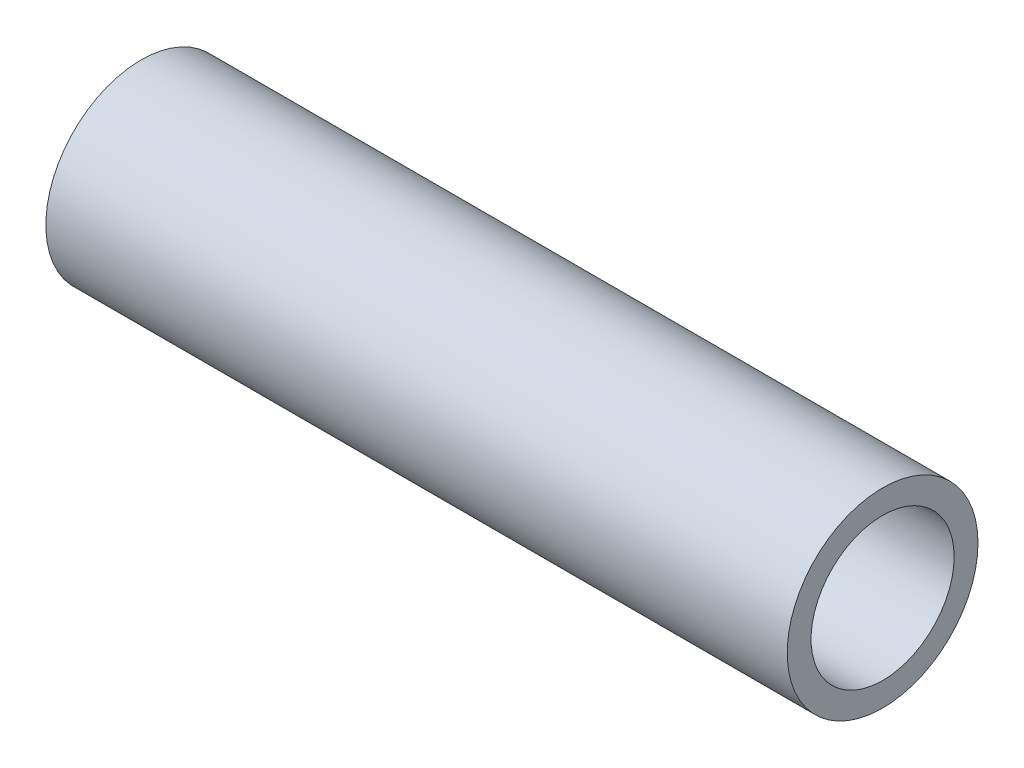
ISO-10303-21;
HEADER;
FILE_DESCRIPTION(('STEP AP214'),'2;1');
FILE_NAME('part.step','',(''),(''),'','','');
FILE_SCHEMA(('AUTOMOTIVE_DESIGN { 1 0 10303 214 1 1 1 1 }'));
ENDSEC;
DATA;
#1=APPLICATION_CONTEXT('core data for automotive mechanical design processes');
#2=APPLICATION_PROTOCOL_DEFINITION('international standard','automotive_design',2000,#1);
#3=PRODUCT_CONTEXT('',#1,'mechanical');
#4=PRODUCT('Part','Part','',(#3));
#5=PRODUCT_RELATED_PRODUCT_CATEGORY('part','',(#4));
#6=PRODUCT_DEFINITION_FORMATION('','',#4);
#7=PRODUCT_DEFINITION_CONTEXT('part definition',#1,'design');
#8=PRODUCT_DEFINITION('design','',#6,#7);
#9=PRODUCT_DEFINITION_SHAPE('','',#8);
#10=(LENGTH_UNIT() NAMED_UNIT(*) SI_UNIT(.MILLI.,.METRE.));
#11=(NAMED_UNIT(*) PLANE_ANGLE_UNIT() SI_UNIT($,.RADIAN.));
#12=(NAMED_UNIT(*) SI_UNIT($,.STERADIAN.) SOLID_ANGLE_UNIT());
#13=UNCERTAINTY_MEASURE_WITH_UNIT(LENGTH_MEASURE(1.E-05),#10,'distance_accuracy_value','');
#14=(GEOMETRIC_REPRESENTATION_CONTEXT(3) GLOBAL_UNCERTAINTY_ASSIGNED_CONTEXT((#13)) GLOBAL_UNIT_ASSIGNED_CONTEXT((#10,
#11,#12)) REPRESENTATION_CONTEXT('',''));
#15=CARTESIAN_POINT('',(0.,0.,0.));
#16=DIRECTION('',(0.,0.,1.));
#17=DIRECTION('',(1.,0.,0.));
#18=AXIS2_PLACEMENT_3D('',#15,#16,#17);
#19=CARTESIAN_POINT('',(54.4,0.,0.));
#20=DIRECTION('',(1.,0.,0.));
#21=DIRECTION('',(0.,0.,-1.));
#22=AXIS2_PLACEMENT_3D('',#19,#20,#21);
#23=PLANE('',#22);
#24=CARTESIAN_POINT('',(54.4,0.,0.));
#25=DIRECTION('',(1.,0.,0.));
#26=DIRECTION('',(0.,0.,-1.));
#27=AXIS2_PLACEMENT_3D('',#24,#25,#26);
#28=CIRCLE('',#27,7.);
#29=CARTESIAN_POINT('',(54.4,0.,-7.));
#30=VERTEX_POINT('',#29);
#31=EDGE_CURVE('E10',#30,#30,#28,.T.);
#32=ORIENTED_EDGE('',*,*,#31,.T.);
#33=EDGE_LOOP('',(#32));
#34=FACE_BOUND('',#33,.T.);
#35=CARTESIAN_POINT('',(54.4,0.,0.));
#36=DIRECTION('',(1.,0.,0.));
#37=DIRECTION('',(0.,0.,-1.));
#38=AXIS2_PLACEMENT_3D('',#35,#36,#37);
#39=CIRCLE('',#38,5.25);
#40=CARTESIAN_POINT('',(54.4,0.,-5.25));
#41=VERTEX_POINT('',#40);
#42=EDGE_CURVE('E54',#41,#41,#39,.T.);
#43=ORIENTED_EDGE('',*,*,#42,.F.);
#44=EDGE_LOOP('',(#43));
#45=FACE_BOUND('',#44,.T.);
#46=ADVANCED_FACE('F41',(#34,#45),#23,.T.);
#47=CARTESIAN_POINT('',(0.,0.,0.));
#48=DIRECTION('',(1.,0.,0.));
#49=DIRECTION('',(0.,0.,-1.));
#50=AXIS2_PLACEMENT_3D('',#47,#48,#49);
#51=PLANE('',#50);
#52=CARTESIAN_POINT('',(0.,0.,0.));
#53=DIRECTION('',(1.,0.,0.));
#54=DIRECTION('',(0.,0.,-1.));
#55=AXIS2_PLACEMENT_3D('',#52,#53,#54);
#56=CIRCLE('',#55,7.);
#57=CARTESIAN_POINT('',(0.,0.,-7.));
#58=VERTEX_POINT('',#57);
#59=EDGE_CURVE('E45',#58,#58,#56,.T.);
#60=ORIENTED_EDGE('',*,*,#59,.F.);
#61=EDGE_LOOP('',(#60));
#62=FACE_BOUND('',#61,.T.);
#63=CARTESIAN_POINT('',(0.,0.,0.));
#64=DIRECTION('',(1.,0.,0.));
#65=DIRECTION('',(0.,0.,-1.));
#66=AXIS2_PLACEMENT_3D('',#63,#64,#65);
#67=CIRCLE('',#66,5.25);
#68=CARTESIAN_POINT('',(0.,0.,-5.25));
#69=VERTEX_POINT('',#68);
#70=EDGE_CURVE('E56',#69,#69,#67,.T.);
#71=ORIENTED_EDGE('',*,*,#70,.T.);
#72=EDGE_LOOP('',(#71));
#73=FACE_BOUND('',#72,.T.);
#74=ADVANCED_FACE('F68',(#62,#73),#51,.F.);
#75=CARTESIAN_POINT('',(54.4,0.,0.));
#76=DIRECTION('',(-1.,0.,0.));
#77=DIRECTION('',(0.,0.,1.));
#78=AXIS2_PLACEMENT_3D('',#75,#76,#77);
#79=CYLINDRICAL_SURFACE('',#78,7.);
#80=ORIENTED_EDGE('',*,*,#31,.F.);
#81=EDGE_LOOP('',(#80));
#82=FACE_BOUND('',#81,.T.);
#83=ORIENTED_EDGE('',*,*,#59,.T.);
#84=EDGE_LOOP('',(#83));
#85=FACE_BOUND('',#84,.T.);
#86=ADVANCED_FACE('F43',(#82,#85),#79,.T.);
#87=CARTESIAN_POINT('',(54.4,0.,0.));
#88=DIRECTION('',(-1.,0.,0.));
#89=DIRECTION('',(0.,0.,1.));
#90=AXIS2_PLACEMENT_3D('',#87,#88,#89);
#91=CYLINDRICAL_SURFACE('',#90,5.25);
#92=ORIENTED_EDGE('',*,*,#42,.T.);
#93=EDGE_LOOP('',(#92));
#94=FACE_BOUND('',#93,.T.);
#95=ORIENTED_EDGE('',*,*,#70,.F.);
#96=EDGE_LOOP('',(#95));
#97=FACE_BOUND('',#96,.T.);
#98=ADVANCED_FACE('F64',(#94,#97),#91,.F.);
#99=CLOSED_SHELL('',(#46,#74,#86,#98));
#100=MANIFOLD_SOLID_BREP('B2',#99);
#101=ADVANCED_BREP_SHAPE_REPRESENTATION('',(#18,#100),#14);
#102=SHAPE_DEFINITION_REPRESENTATION(#9,#101);
ENDSEC;
END-ISO-10303-21;
